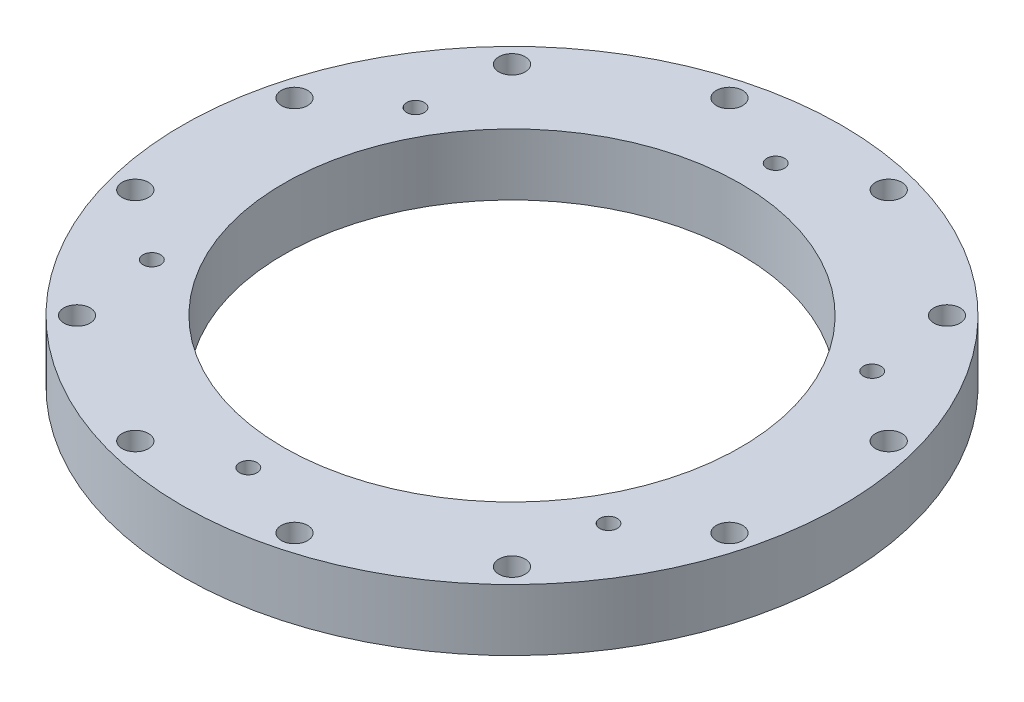
ISO-10303-21;
HEADER;
FILE_DESCRIPTION(('STEP AP214'),'2;1');
FILE_NAME('part.step','',(''),(''),'','','');
FILE_SCHEMA(('AUTOMOTIVE_DESIGN { 1 0 10303 214 1 1 1 1 }'));
ENDSEC;
DATA;
#1=APPLICATION_CONTEXT('core data for automotive mechanical design processes');
#2=APPLICATION_PROTOCOL_DEFINITION('international standard','automotive_design',2000,#1);
#3=PRODUCT_CONTEXT('',#1,'mechanical');
#4=PRODUCT('Part','Part','',(#3));
#5=PRODUCT_RELATED_PRODUCT_CATEGORY('part','',(#4));
#6=PRODUCT_DEFINITION_FORMATION('','',#4);
#7=PRODUCT_DEFINITION_CONTEXT('part definition',#1,'design');
#8=PRODUCT_DEFINITION('design','',#6,#7);
#9=PRODUCT_DEFINITION_SHAPE('','',#8);
#10=(LENGTH_UNIT() NAMED_UNIT(*) SI_UNIT(.MILLI.,.METRE.));
#11=(NAMED_UNIT(*) PLANE_ANGLE_UNIT() SI_UNIT($,.RADIAN.));
#12=(NAMED_UNIT(*) SI_UNIT($,.STERADIAN.) SOLID_ANGLE_UNIT());
#13=UNCERTAINTY_MEASURE_WITH_UNIT(LENGTH_MEASURE(1.E-05),#10,'distance_accuracy_value','');
#14=(GEOMETRIC_REPRESENTATION_CONTEXT(3) GLOBAL_UNCERTAINTY_ASSIGNED_CONTEXT((#13)) GLOBAL_UNIT_ASSIGNED_CONTEXT((#10,
#11,#12)) REPRESENTATION_CONTEXT('',''));
#15=CARTESIAN_POINT('',(0.,0.,0.));
#16=DIRECTION('',(0.,0.,1.));
#17=DIRECTION('',(1.,0.,0.));
#18=AXIS2_PLACEMENT_3D('',#15,#16,#17);
#19=CARTESIAN_POINT('',(0.,7.,0.));
#20=DIRECTION('',(0.,1.,0.));
#21=DIRECTION('',(0.,0.,1.));
#22=AXIS2_PLACEMENT_3D('',#19,#20,#21);
#23=PLANE('',#22);
#24=CARTESIAN_POINT('',(-9.05866657858883,7.,33.8074039201172));
#25=DIRECTION('',(0.,1.,0.));
#26=DIRECTION('',(0.,0.,1.));
#27=AXIS2_PLACEMENT_3D('',#24,#25,#26);
#28=CIRCLE('',#27,1.5);
#29=CARTESIAN_POINT('',(-9.05866657858883,7.,35.3074039201172));
#30=VERTEX_POINT('',#29);
#31=EDGE_CURVE('E143',#30,#30,#28,.T.);
#32=ORIENTED_EDGE('',*,*,#31,.F.);
#33=EDGE_LOOP('',(#32));
#34=FACE_BOUND('',#33,.T.);
#35=CARTESIAN_POINT('',(24.7487373415288,7.,24.7487373415295));
#36=DIRECTION('',(0.,1.,0.));
#37=DIRECTION('',(0.,0.,1.));
#38=AXIS2_PLACEMENT_3D('',#35,#36,#37);
#39=CIRCLE('',#38,1.5);
#40=CARTESIAN_POINT('',(24.7487373415288,7.,26.2487373415295));
#41=VERTEX_POINT('',#40);
#42=EDGE_CURVE('E131',#41,#41,#39,.T.);
#43=ORIENTED_EDGE('',*,*,#42,.F.);
#44=EDGE_LOOP('',(#43));
#45=FACE_BOUND('',#44,.T.);
#46=CARTESIAN_POINT('',(33.8074039201175,7.,-9.05866657858778));
#47=DIRECTION('',(0.,1.,0.));
#48=DIRECTION('',(0.,0.,1.));
#49=AXIS2_PLACEMENT_3D('',#46,#47,#48);
#50=CIRCLE('',#49,1.5);
#51=CARTESIAN_POINT('',(33.8074039201175,7.,-7.55866657858777));
#52=VERTEX_POINT('',#51);
#53=EDGE_CURVE('E119',#52,#52,#50,.T.);
#54=ORIENTED_EDGE('',*,*,#53,.F.);
#55=EDGE_LOOP('',(#54));
#56=FACE_BOUND('',#55,.T.);
#57=CARTESIAN_POINT('',(9.05866657858861,7.,-33.8074039201173));
#58=DIRECTION('',(0.,1.,0.));
#59=DIRECTION('',(0.,0.,1.));
#60=AXIS2_PLACEMENT_3D('',#57,#58,#59);
#61=CIRCLE('',#60,1.5);
#62=CARTESIAN_POINT('',(9.05866657858861,7.,-32.3074039201173));
#63=VERTEX_POINT('',#62);
#64=EDGE_CURVE('E107',#63,#63,#61,.T.);
#65=ORIENTED_EDGE('',*,*,#64,.F.);
#66=EDGE_LOOP('',(#65));
#67=FACE_BOUND('',#66,.T.);
#68=CARTESIAN_POINT('',(-24.7487373415289,7.,-24.7487373415294));
#69=DIRECTION('',(0.,1.,0.));
#70=DIRECTION('',(0.,0.,1.));
#71=AXIS2_PLACEMENT_3D('',#68,#69,#70);
#72=CIRCLE('',#71,1.5);
#73=CARTESIAN_POINT('',(-24.7487373415289,7.,-23.2487373415294));
#74=VERTEX_POINT('',#73);
#75=EDGE_CURVE('E95',#74,#74,#72,.T.);
#76=ORIENTED_EDGE('',*,*,#75,.F.);
#77=EDGE_LOOP('',(#76));
#78=FACE_BOUND('',#77,.T.);
#79=CARTESIAN_POINT('',(-33.8074039201175,7.,9.05866657858801));
#80=DIRECTION('',(0.,1.,0.));
#81=DIRECTION('',(0.,0.,1.));
#82=AXIS2_PLACEMENT_3D('',#79,#80,#81);
#83=CIRCLE('',#82,1.5);
#84=CARTESIAN_POINT('',(-33.8074039201175,7.,10.558666578588));
#85=VERTEX_POINT('',#84);
#86=EDGE_CURVE('E83',#85,#85,#83,.T.);
#87=ORIENTED_EDGE('',*,*,#86,.F.);
#88=EDGE_LOOP('',(#87));
#89=FACE_BOUND('',#88,.T.);
#90=CARTESIAN_POINT('',(-25.9807621135312,7.,15.0000000000011));
#91=DIRECTION('',(0.,1.,0.));
#92=DIRECTION('',(0.,0.,1.));
#93=AXIS2_PLACEMENT_3D('',#90,#91,#92);
#94=CIRCLE('',#93,1.00000000000243);
#95=CARTESIAN_POINT('',(-25.9807621135312,7.,16.0000000000035));
#96=VERTEX_POINT('',#95);
#97=EDGE_CURVE('E71',#96,#96,#94,.T.);
#98=ORIENTED_EDGE('',*,*,#97,.F.);
#99=EDGE_LOOP('',(#98));
#100=FACE_BOUND('',#99,.T.);
#101=CARTESIAN_POINT('',(25.9807621135351,7.,14.9999999999989));
#102=DIRECTION('',(0.,1.,0.));
#103=DIRECTION('',(0.,0.,1.));
#104=AXIS2_PLACEMENT_3D('',#101,#102,#103);
#105=CIRCLE('',#104,1.00000000000165);
#106=CARTESIAN_POINT('',(25.9807621135351,7.,16.0000000000005));
#107=VERTEX_POINT('',#106);
#108=EDGE_CURVE('E59',#107,#107,#105,.T.);
#109=ORIENTED_EDGE('',*,*,#108,.F.);
#110=EDGE_LOOP('',(#109));
#111=FACE_BOUND('',#110,.T.);
#112=CARTESIAN_POINT('',(0.,7.,-30.));
#113=DIRECTION('',(0.,1.,0.));
#114=DIRECTION('',(0.,0.,1.));
#115=AXIS2_PLACEMENT_3D('',#112,#113,#114);
#116=CIRCLE('',#115,1.);
#117=CARTESIAN_POINT('',(0.,7.,-29.));
#118=VERTEX_POINT('',#117);
#119=EDGE_CURVE('E47',#118,#118,#116,.T.);
#120=ORIENTED_EDGE('',*,*,#119,.F.);
#121=EDGE_LOOP('',(#120));
#122=FACE_BOUND('',#121,.T.);
#123=CARTESIAN_POINT('',(0.,7.,0.));
#124=DIRECTION('',(0.,1.,0.));
#125=DIRECTION('',(0.,0.,1.));
#126=AXIS2_PLACEMENT_3D('',#123,#124,#125);
#127=CIRCLE('',#126,37.5);
#128=CARTESIAN_POINT('',(0.,7.,37.5));
#129=VERTEX_POINT('',#128);
#130=EDGE_CURVE('E10',#129,#129,#127,.T.);
#131=ORIENTED_EDGE('',*,*,#130,.T.);
#132=EDGE_LOOP('',(#131));
#133=FACE_BOUND('',#132,.T.);
#134=CARTESIAN_POINT('',(0.,7.,0.));
#135=DIRECTION('',(0.,1.,0.));
#136=DIRECTION('',(0.,0.,1.));
#137=AXIS2_PLACEMENT_3D('',#134,#135,#136);
#138=CIRCLE('',#137,26.);
#139=CARTESIAN_POINT('',(0.,7.,26.));
#140=VERTEX_POINT('',#139);
#141=EDGE_CURVE('E42',#140,#140,#138,.T.);
#142=ORIENTED_EDGE('',*,*,#141,.F.);
#143=EDGE_LOOP('',(#142));
#144=FACE_BOUND('',#143,.T.);
#145=CARTESIAN_POINT('',(25.9807621135338,7.,-15.0000000000011));
#146=DIRECTION('',(0.,1.,0.));
#147=DIRECTION('',(0.,0.,1.));
#148=AXIS2_PLACEMENT_3D('',#145,#146,#147);
#149=CIRCLE('',#148,1.00000000000036);
#150=CARTESIAN_POINT('',(25.9807621135338,7.,-14.0000000000007));
#151=VERTEX_POINT('',#150);
#152=EDGE_CURVE('E53',#151,#151,#149,.T.);
#153=ORIENTED_EDGE('',*,*,#152,.F.);
#154=EDGE_LOOP('',(#153));
#155=FACE_BOUND('',#154,.T.);
#156=CARTESIAN_POINT('',(2.54693202754403E-12,7.,30.));
#157=DIRECTION('',(0.,1.,0.));
#158=DIRECTION('',(0.,0.,1.));
#159=AXIS2_PLACEMENT_3D('',#156,#157,#158);
#160=CIRCLE('',#159,1.00000000000264);
#161=CARTESIAN_POINT('',(2.54693202754403E-12,7.,31.0000000000026));
#162=VERTEX_POINT('',#161);
#163=EDGE_CURVE('E65',#162,#162,#160,.T.);
#164=ORIENTED_EDGE('',*,*,#163,.F.);
#165=EDGE_LOOP('',(#164));
#166=FACE_BOUND('',#165,.T.);
#167=CARTESIAN_POINT('',(-25.9807621135325,7.,-14.9999999999989));
#168=DIRECTION('',(0.,1.,0.));
#169=DIRECTION('',(0.,0.,1.));
#170=AXIS2_PLACEMENT_3D('',#167,#168,#169);
#171=CIRCLE('',#170,1.00000000000129);
#172=CARTESIAN_POINT('',(-25.9807621135325,7.,-13.9999999999976));
#173=VERTEX_POINT('',#172);
#174=EDGE_CURVE('E77',#173,#173,#171,.T.);
#175=ORIENTED_EDGE('',*,*,#174,.F.);
#176=EDGE_LOOP('',(#175));
#177=FACE_BOUND('',#176,.T.);
#178=CARTESIAN_POINT('',(-33.8074039201173,7.,-9.05866657858849));
#179=DIRECTION('',(0.,1.,0.));
#180=DIRECTION('',(0.,0.,1.));
#181=AXIS2_PLACEMENT_3D('',#178,#179,#180);
#182=CIRCLE('',#181,1.50000000000001);
#183=CARTESIAN_POINT('',(-33.8074039201173,7.,-7.55866657858848));
#184=VERTEX_POINT('',#183);
#185=EDGE_CURVE('E89',#184,#184,#182,.T.);
#186=ORIENTED_EDGE('',*,*,#185,.F.);
#187=EDGE_LOOP('',(#186));
#188=FACE_BOUND('',#187,.T.);
#189=CARTESIAN_POINT('',(-9.05866657858789,7.,-33.8074039201175));
#190=DIRECTION('',(0.,1.,0.));
#191=DIRECTION('',(0.,0.,1.));
#192=AXIS2_PLACEMENT_3D('',#189,#190,#191);
#193=CIRCLE('',#192,1.50000000000001);
#194=CARTESIAN_POINT('',(-9.05866657858789,7.,-32.3074039201175));
#195=VERTEX_POINT('',#194);
#196=EDGE_CURVE('E101',#195,#195,#193,.T.);
#197=ORIENTED_EDGE('',*,*,#196,.F.);
#198=EDGE_LOOP('',(#197));
#199=FACE_BOUND('',#198,.T.);
#200=CARTESIAN_POINT('',(24.7487373415295,7.,-24.7487373415289));
#201=DIRECTION('',(0.,1.,0.));
#202=DIRECTION('',(0.,0.,1.));
#203=AXIS2_PLACEMENT_3D('',#200,#201,#202);
#204=CIRCLE('',#203,1.5);
#205=CARTESIAN_POINT('',(24.7487373415295,7.,-23.2487373415289));
#206=VERTEX_POINT('',#205);
#207=EDGE_CURVE('E113',#206,#206,#204,.T.);
#208=ORIENTED_EDGE('',*,*,#207,.F.);
#209=EDGE_LOOP('',(#208));
#210=FACE_BOUND('',#209,.T.);
#211=CARTESIAN_POINT('',(33.8074039201173,7.,9.05866657858872));
#212=DIRECTION('',(0.,1.,0.));
#213=DIRECTION('',(0.,0.,1.));
#214=AXIS2_PLACEMENT_3D('',#211,#212,#213);
#215=CIRCLE('',#214,1.50000000000001);
#216=CARTESIAN_POINT('',(33.8074039201173,7.,10.5586665785887));
#217=VERTEX_POINT('',#216);
#218=EDGE_CURVE('E125',#217,#217,#215,.T.);
#219=ORIENTED_EDGE('',*,*,#218,.F.);
#220=EDGE_LOOP('',(#219));
#221=FACE_BOUND('',#220,.T.);
#222=CARTESIAN_POINT('',(9.05866657858765,7.,33.8074039201176));
#223=DIRECTION('',(0.,1.,0.));
#224=DIRECTION('',(0.,0.,1.));
#225=AXIS2_PLACEMENT_3D('',#222,#223,#224);
#226=CIRCLE('',#225,1.50000000000001);
#227=CARTESIAN_POINT('',(9.05866657858765,7.,35.3074039201176));
#228=VERTEX_POINT('',#227);
#229=EDGE_CURVE('E137',#228,#228,#226,.T.);
#230=ORIENTED_EDGE('',*,*,#229,.F.);
#231=EDGE_LOOP('',(#230));
#232=FACE_BOUND('',#231,.T.);
#233=CARTESIAN_POINT('',(-24.7487373415296,7.,24.7487373415287));
#234=DIRECTION('',(0.,1.,0.));
#235=DIRECTION('',(0.,0.,1.));
#236=AXIS2_PLACEMENT_3D('',#233,#234,#235);
#237=CIRCLE('',#236,1.50000000000001);
#238=CARTESIAN_POINT('',(-24.7487373415296,7.,26.2487373415287));
#239=VERTEX_POINT('',#238);
#240=EDGE_CURVE('E149',#239,#239,#237,.T.);
#241=ORIENTED_EDGE('',*,*,#240,.F.);
#242=EDGE_LOOP('',(#241));
#243=FACE_BOUND('',#242,.T.);
#244=ADVANCED_FACE('F31',(#34,#45,#56,#67,#78,#89,#100,#111,#122,#133,#144,#155,#166,#177,#188,
#199,#210,#221,#232,#243),#23,.T.);
#245=CARTESIAN_POINT('',(0.,0.,0.));
#246=DIRECTION('',(0.,1.,0.));
#247=DIRECTION('',(0.,0.,1.));
#248=AXIS2_PLACEMENT_3D('',#245,#246,#247);
#249=PLANE('',#248);
#250=CARTESIAN_POINT('',(0.,0.,0.));
#251=DIRECTION('',(0.,1.,0.));
#252=DIRECTION('',(0.,0.,1.));
#253=AXIS2_PLACEMENT_3D('',#250,#251,#252);
#254=CIRCLE('',#253,37.5);
#255=CARTESIAN_POINT('',(0.,0.,37.5));
#256=VERTEX_POINT('',#255);
#257=EDGE_CURVE('E35',#256,#256,#254,.T.);
#258=ORIENTED_EDGE('',*,*,#257,.F.);
#259=EDGE_LOOP('',(#258));
#260=FACE_BOUND('',#259,.T.);
#261=CARTESIAN_POINT('',(0.,0.,0.));
#262=DIRECTION('',(0.,1.,0.));
#263=DIRECTION('',(0.,0.,1.));
#264=AXIS2_PLACEMENT_3D('',#261,#262,#263);
#265=CIRCLE('',#264,26.);
#266=CARTESIAN_POINT('',(0.,0.,26.));
#267=VERTEX_POINT('',#266);
#268=EDGE_CURVE('E44',#267,#267,#265,.T.);
#269=ORIENTED_EDGE('',*,*,#268,.T.);
#270=EDGE_LOOP('',(#269));
#271=FACE_BOUND('',#270,.T.);
#272=CARTESIAN_POINT('',(0.,0.,-30.));
#273=DIRECTION('',(0.,1.,0.));
#274=DIRECTION('',(0.,0.,1.));
#275=AXIS2_PLACEMENT_3D('',#272,#273,#274);
#276=CIRCLE('',#275,1.);
#277=CARTESIAN_POINT('',(0.,0.,-29.));
#278=VERTEX_POINT('',#277);
#279=EDGE_CURVE('E50',#278,#278,#276,.T.);
#280=ORIENTED_EDGE('',*,*,#279,.T.);
#281=EDGE_LOOP('',(#280));
#282=FACE_BOUND('',#281,.T.);
#283=CARTESIAN_POINT('',(25.9807621135338,0.,-15.0000000000011));
#284=DIRECTION('',(0.,1.,0.));
#285=DIRECTION('',(0.,0.,1.));
#286=AXIS2_PLACEMENT_3D('',#283,#284,#285);
#287=CIRCLE('',#286,1.00000000000036);
#288=CARTESIAN_POINT('',(25.9807621135338,0.,-14.0000000000007));
#289=VERTEX_POINT('',#288);
#290=EDGE_CURVE('E56',#289,#289,#287,.T.);
#291=ORIENTED_EDGE('',*,*,#290,.T.);
#292=EDGE_LOOP('',(#291));
#293=FACE_BOUND('',#292,.T.);
#294=CARTESIAN_POINT('',(25.9807621135351,0.,14.9999999999989));
#295=DIRECTION('',(0.,1.,0.));
#296=DIRECTION('',(0.,0.,1.));
#297=AXIS2_PLACEMENT_3D('',#294,#295,#296);
#298=CIRCLE('',#297,1.00000000000165);
#299=CARTESIAN_POINT('',(25.9807621135351,0.,16.0000000000005));
#300=VERTEX_POINT('',#299);
#301=EDGE_CURVE('E62',#300,#300,#298,.T.);
#302=ORIENTED_EDGE('',*,*,#301,.T.);
#303=EDGE_LOOP('',(#302));
#304=FACE_BOUND('',#303,.T.);
#305=CARTESIAN_POINT('',(2.54693202754403E-12,0.,30.));
#306=DIRECTION('',(0.,1.,0.));
#307=DIRECTION('',(0.,0.,1.));
#308=AXIS2_PLACEMENT_3D('',#305,#306,#307);
#309=CIRCLE('',#308,1.00000000000264);
#310=CARTESIAN_POINT('',(2.54693202754403E-12,0.,31.0000000000026));
#311=VERTEX_POINT('',#310);
#312=EDGE_CURVE('E68',#311,#311,#309,.T.);
#313=ORIENTED_EDGE('',*,*,#312,.T.);
#314=EDGE_LOOP('',(#313));
#315=FACE_BOUND('',#314,.T.);
#316=CARTESIAN_POINT('',(-25.9807621135312,0.,15.0000000000011));
#317=DIRECTION('',(0.,1.,0.));
#318=DIRECTION('',(0.,0.,1.));
#319=AXIS2_PLACEMENT_3D('',#316,#317,#318);
#320=CIRCLE('',#319,1.00000000000243);
#321=CARTESIAN_POINT('',(-25.9807621135312,0.,16.0000000000035));
#322=VERTEX_POINT('',#321);
#323=EDGE_CURVE('E74',#322,#322,#320,.T.);
#324=ORIENTED_EDGE('',*,*,#323,.T.);
#325=EDGE_LOOP('',(#324));
#326=FACE_BOUND('',#325,.T.);
#327=CARTESIAN_POINT('',(-25.9807621135325,0.,-14.9999999999989));
#328=DIRECTION('',(0.,1.,0.));
#329=DIRECTION('',(0.,0.,1.));
#330=AXIS2_PLACEMENT_3D('',#327,#328,#329);
#331=CIRCLE('',#330,1.00000000000129);
#332=CARTESIAN_POINT('',(-25.9807621135325,0.,-13.9999999999976));
#333=VERTEX_POINT('',#332);
#334=EDGE_CURVE('E80',#333,#333,#331,.T.);
#335=ORIENTED_EDGE('',*,*,#334,.T.);
#336=EDGE_LOOP('',(#335));
#337=FACE_BOUND('',#336,.T.);
#338=CARTESIAN_POINT('',(-33.8074039201175,0.,9.05866657858801));
#339=DIRECTION('',(0.,1.,0.));
#340=DIRECTION('',(0.,0.,1.));
#341=AXIS2_PLACEMENT_3D('',#338,#339,#340);
#342=CIRCLE('',#341,1.5);
#343=CARTESIAN_POINT('',(-33.8074039201175,0.,10.558666578588));
#344=VERTEX_POINT('',#343);
#345=EDGE_CURVE('E86',#344,#344,#342,.T.);
#346=ORIENTED_EDGE('',*,*,#345,.T.);
#347=EDGE_LOOP('',(#346));
#348=FACE_BOUND('',#347,.T.);
#349=CARTESIAN_POINT('',(-33.8074039201173,0.,-9.05866657858849));
#350=DIRECTION('',(0.,1.,0.));
#351=DIRECTION('',(0.,0.,1.));
#352=AXIS2_PLACEMENT_3D('',#349,#350,#351);
#353=CIRCLE('',#352,1.50000000000001);
#354=CARTESIAN_POINT('',(-33.8074039201173,0.,-7.55866657858848));
#355=VERTEX_POINT('',#354);
#356=EDGE_CURVE('E92',#355,#355,#353,.T.);
#357=ORIENTED_EDGE('',*,*,#356,.T.);
#358=EDGE_LOOP('',(#357));
#359=FACE_BOUND('',#358,.T.);
#360=CARTESIAN_POINT('',(-24.7487373415289,0.,-24.7487373415294));
#361=DIRECTION('',(0.,1.,0.));
#362=DIRECTION('',(0.,0.,1.));
#363=AXIS2_PLACEMENT_3D('',#360,#361,#362);
#364=CIRCLE('',#363,1.5);
#365=CARTESIAN_POINT('',(-24.7487373415289,0.,-23.2487373415294));
#366=VERTEX_POINT('',#365);
#367=EDGE_CURVE('E98',#366,#366,#364,.T.);
#368=ORIENTED_EDGE('',*,*,#367,.T.);
#369=EDGE_LOOP('',(#368));
#370=FACE_BOUND('',#369,.T.);
#371=CARTESIAN_POINT('',(-9.05866657858789,0.,-33.8074039201175));
#372=DIRECTION('',(0.,1.,0.));
#373=DIRECTION('',(0.,0.,1.));
#374=AXIS2_PLACEMENT_3D('',#371,#372,#373);
#375=CIRCLE('',#374,1.50000000000001);
#376=CARTESIAN_POINT('',(-9.05866657858789,0.,-32.3074039201175));
#377=VERTEX_POINT('',#376);
#378=EDGE_CURVE('E104',#377,#377,#375,.T.);
#379=ORIENTED_EDGE('',*,*,#378,.T.);
#380=EDGE_LOOP('',(#379));
#381=FACE_BOUND('',#380,.T.);
#382=CARTESIAN_POINT('',(9.05866657858861,0.,-33.8074039201173));
#383=DIRECTION('',(0.,1.,0.));
#384=DIRECTION('',(0.,0.,1.));
#385=AXIS2_PLACEMENT_3D('',#382,#383,#384);
#386=CIRCLE('',#385,1.5);
#387=CARTESIAN_POINT('',(9.05866657858861,0.,-32.3074039201173));
#388=VERTEX_POINT('',#387);
#389=EDGE_CURVE('E110',#388,#388,#386,.T.);
#390=ORIENTED_EDGE('',*,*,#389,.T.);
#391=EDGE_LOOP('',(#390));
#392=FACE_BOUND('',#391,.T.);
#393=CARTESIAN_POINT('',(24.7487373415295,0.,-24.7487373415289));
#394=DIRECTION('',(0.,1.,0.));
#395=DIRECTION('',(0.,0.,1.));
#396=AXIS2_PLACEMENT_3D('',#393,#394,#395);
#397=CIRCLE('',#396,1.5);
#398=CARTESIAN_POINT('',(24.7487373415295,0.,-23.2487373415289));
#399=VERTEX_POINT('',#398);
#400=EDGE_CURVE('E116',#399,#399,#397,.T.);
#401=ORIENTED_EDGE('',*,*,#400,.T.);
#402=EDGE_LOOP('',(#401));
#403=FACE_BOUND('',#402,.T.);
#404=CARTESIAN_POINT('',(33.8074039201175,0.,-9.05866657858778));
#405=DIRECTION('',(0.,1.,0.));
#406=DIRECTION('',(0.,0.,1.));
#407=AXIS2_PLACEMENT_3D('',#404,#405,#406);
#408=CIRCLE('',#407,1.5);
#409=CARTESIAN_POINT('',(33.8074039201175,0.,-7.55866657858777));
#410=VERTEX_POINT('',#409);
#411=EDGE_CURVE('E122',#410,#410,#408,.T.);
#412=ORIENTED_EDGE('',*,*,#411,.T.);
#413=EDGE_LOOP('',(#412));
#414=FACE_BOUND('',#413,.T.);
#415=CARTESIAN_POINT('',(33.8074039201173,0.,9.05866657858872));
#416=DIRECTION('',(0.,1.,0.));
#417=DIRECTION('',(0.,0.,1.));
#418=AXIS2_PLACEMENT_3D('',#415,#416,#417);
#419=CIRCLE('',#418,1.50000000000001);
#420=CARTESIAN_POINT('',(33.8074039201173,0.,10.5586665785887));
#421=VERTEX_POINT('',#420);
#422=EDGE_CURVE('E128',#421,#421,#419,.T.);
#423=ORIENTED_EDGE('',*,*,#422,.T.);
#424=EDGE_LOOP('',(#423));
#425=FACE_BOUND('',#424,.T.);
#426=CARTESIAN_POINT('',(24.7487373415288,0.,24.7487373415295));
#427=DIRECTION('',(0.,1.,0.));
#428=DIRECTION('',(0.,0.,1.));
#429=AXIS2_PLACEMENT_3D('',#426,#427,#428);
#430=CIRCLE('',#429,1.5);
#431=CARTESIAN_POINT('',(24.7487373415288,0.,26.2487373415295));
#432=VERTEX_POINT('',#431);
#433=EDGE_CURVE('E134',#432,#432,#430,.T.);
#434=ORIENTED_EDGE('',*,*,#433,.T.);
#435=EDGE_LOOP('',(#434));
#436=FACE_BOUND('',#435,.T.);
#437=CARTESIAN_POINT('',(9.05866657858765,0.,33.8074039201176));
#438=DIRECTION('',(0.,1.,0.));
#439=DIRECTION('',(0.,0.,1.));
#440=AXIS2_PLACEMENT_3D('',#437,#438,#439);
#441=CIRCLE('',#440,1.50000000000001);
#442=CARTESIAN_POINT('',(9.05866657858765,0.,35.3074039201176));
#443=VERTEX_POINT('',#442);
#444=EDGE_CURVE('E140',#443,#443,#441,.T.);
#445=ORIENTED_EDGE('',*,*,#444,.T.);
#446=EDGE_LOOP('',(#445));
#447=FACE_BOUND('',#446,.T.);
#448=CARTESIAN_POINT('',(-9.05866657858883,0.,33.8074039201172));
#449=DIRECTION('',(0.,1.,0.));
#450=DIRECTION('',(0.,0.,1.));
#451=AXIS2_PLACEMENT_3D('',#448,#449,#450);
#452=CIRCLE('',#451,1.5);
#453=CARTESIAN_POINT('',(-9.05866657858883,0.,35.3074039201172));
#454=VERTEX_POINT('',#453);
#455=EDGE_CURVE('E146',#454,#454,#452,.T.);
#456=ORIENTED_EDGE('',*,*,#455,.T.);
#457=EDGE_LOOP('',(#456));
#458=FACE_BOUND('',#457,.T.);
#459=CARTESIAN_POINT('',(-24.7487373415296,0.,24.7487373415287));
#460=DIRECTION('',(0.,1.,0.));
#461=DIRECTION('',(0.,0.,1.));
#462=AXIS2_PLACEMENT_3D('',#459,#460,#461);
#463=CIRCLE('',#462,1.50000000000001);
#464=CARTESIAN_POINT('',(-24.7487373415296,0.,26.2487373415287));
#465=VERTEX_POINT('',#464);
#466=EDGE_CURVE('E152',#465,#465,#463,.T.);
#467=ORIENTED_EDGE('',*,*,#466,.T.);
#468=EDGE_LOOP('',(#467));
#469=FACE_BOUND('',#468,.T.);
#470=ADVANCED_FACE('F162',(#260,#271,#282,#293,#304,#315,#326,#337,#348,#359,#370,#381,#392,
#403,#414,#425,#436,#447,#458,#469),#249,.F.);
#471=CARTESIAN_POINT('',(0.,7.,0.));
#472=DIRECTION('',(0.,-1.,0.));
#473=DIRECTION('',(0.,0.,-1.));
#474=AXIS2_PLACEMENT_3D('',#471,#472,#473);
#475=CYLINDRICAL_SURFACE('',#474,37.5);
#476=ORIENTED_EDGE('',*,*,#130,.F.);
#477=EDGE_LOOP('',(#476));
#478=FACE_BOUND('',#477,.T.);
#479=ORIENTED_EDGE('',*,*,#257,.T.);
#480=EDGE_LOOP('',(#479));
#481=FACE_BOUND('',#480,.T.);
#482=ADVANCED_FACE('F33',(#478,#481),#475,.T.);
#483=CARTESIAN_POINT('',(0.,7.,0.));
#484=DIRECTION('',(0.,-1.,0.));
#485=DIRECTION('',(0.,0.,-1.));
#486=AXIS2_PLACEMENT_3D('',#483,#484,#485);
#487=CYLINDRICAL_SURFACE('',#486,26.);
#488=ORIENTED_EDGE('',*,*,#141,.T.);
#489=EDGE_LOOP('',(#488));
#490=FACE_BOUND('',#489,.T.);
#491=ORIENTED_EDGE('',*,*,#268,.F.);
#492=EDGE_LOOP('',(#491));
#493=FACE_BOUND('',#492,.T.);
#494=ADVANCED_FACE('F172',(#490,#493),#487,.F.);
#495=CARTESIAN_POINT('',(0.,7.,-30.));
#496=DIRECTION('',(0.,-1.,0.));
#497=DIRECTION('',(0.,0.,-1.));
#498=AXIS2_PLACEMENT_3D('',#495,#496,#497);
#499=CYLINDRICAL_SURFACE('',#498,1.);
#500=ORIENTED_EDGE('',*,*,#119,.T.);
#501=EDGE_LOOP('',(#500));
#502=FACE_BOUND('',#501,.T.);
#503=ORIENTED_EDGE('',*,*,#279,.F.);
#504=EDGE_LOOP('',(#503));
#505=FACE_BOUND('',#504,.T.);
#506=ADVANCED_FACE('F175',(#502,#505),#499,.F.);
#507=CARTESIAN_POINT('',(25.9807621135338,7.,-15.0000000000011));
#508=DIRECTION('',(0.,-1.,0.));
#509=DIRECTION('',(0.,0.,-1.));
#510=AXIS2_PLACEMENT_3D('',#507,#508,#509);
#511=CYLINDRICAL_SURFACE('',#510,1.00000000000036);
#512=ORIENTED_EDGE('',*,*,#152,.T.);
#513=EDGE_LOOP('',(#512));
#514=FACE_BOUND('',#513,.T.);
#515=ORIENTED_EDGE('',*,*,#290,.F.);
#516=EDGE_LOOP('',(#515));
#517=FACE_BOUND('',#516,.T.);
#518=ADVANCED_FACE('F179',(#514,#517),#511,.F.);
#519=CARTESIAN_POINT('',(25.9807621135351,7.,14.9999999999989));
#520=DIRECTION('',(0.,-1.,0.));
#521=DIRECTION('',(0.,0.,-1.));
#522=AXIS2_PLACEMENT_3D('',#519,#520,#521);
#523=CYLINDRICAL_SURFACE('',#522,1.00000000000165);
#524=ORIENTED_EDGE('',*,*,#108,.T.);
#525=EDGE_LOOP('',(#524));
#526=FACE_BOUND('',#525,.T.);
#527=ORIENTED_EDGE('',*,*,#301,.F.);
#528=EDGE_LOOP('',(#527));
#529=FACE_BOUND('',#528,.T.);
#530=ADVANCED_FACE('F183',(#526,#529),#523,.F.);
#531=CARTESIAN_POINT('',(2.54693202754403E-12,7.,30.));
#532=DIRECTION('',(0.,-1.,0.));
#533=DIRECTION('',(0.,0.,-1.));
#534=AXIS2_PLACEMENT_3D('',#531,#532,#533);
#535=CYLINDRICAL_SURFACE('',#534,1.00000000000264);
#536=ORIENTED_EDGE('',*,*,#163,.T.);
#537=EDGE_LOOP('',(#536));
#538=FACE_BOUND('',#537,.T.);
#539=ORIENTED_EDGE('',*,*,#312,.F.);
#540=EDGE_LOOP('',(#539));
#541=FACE_BOUND('',#540,.T.);
#542=ADVANCED_FACE('F187',(#538,#541),#535,.F.);
#543=CARTESIAN_POINT('',(-25.9807621135312,7.,15.0000000000011));
#544=DIRECTION('',(0.,-1.,0.));
#545=DIRECTION('',(0.,0.,-1.));
#546=AXIS2_PLACEMENT_3D('',#543,#544,#545);
#547=CYLINDRICAL_SURFACE('',#546,1.00000000000243);
#548=ORIENTED_EDGE('',*,*,#97,.T.);
#549=EDGE_LOOP('',(#548));
#550=FACE_BOUND('',#549,.T.);
#551=ORIENTED_EDGE('',*,*,#323,.F.);
#552=EDGE_LOOP('',(#551));
#553=FACE_BOUND('',#552,.T.);
#554=ADVANCED_FACE('F191',(#550,#553),#547,.F.);
#555=CARTESIAN_POINT('',(-25.9807621135325,7.,-14.9999999999989));
#556=DIRECTION('',(0.,-1.,0.));
#557=DIRECTION('',(0.,0.,-1.));
#558=AXIS2_PLACEMENT_3D('',#555,#556,#557);
#559=CYLINDRICAL_SURFACE('',#558,1.00000000000129);
#560=ORIENTED_EDGE('',*,*,#174,.T.);
#561=EDGE_LOOP('',(#560));
#562=FACE_BOUND('',#561,.T.);
#563=ORIENTED_EDGE('',*,*,#334,.F.);
#564=EDGE_LOOP('',(#563));
#565=FACE_BOUND('',#564,.T.);
#566=ADVANCED_FACE('F195',(#562,#565),#559,.F.);
#567=CARTESIAN_POINT('',(-33.8074039201175,7.,9.05866657858801));
#568=DIRECTION('',(0.,-1.,0.));
#569=DIRECTION('',(0.,0.,-1.));
#570=AXIS2_PLACEMENT_3D('',#567,#568,#569);
#571=CYLINDRICAL_SURFACE('',#570,1.5);
#572=ORIENTED_EDGE('',*,*,#86,.T.);
#573=EDGE_LOOP('',(#572));
#574=FACE_BOUND('',#573,.T.);
#575=ORIENTED_EDGE('',*,*,#345,.F.);
#576=EDGE_LOOP('',(#575));
#577=FACE_BOUND('',#576,.T.);
#578=ADVANCED_FACE('F199',(#574,#577),#571,.F.);
#579=CARTESIAN_POINT('',(-33.8074039201173,7.,-9.05866657858849));
#580=DIRECTION('',(0.,-1.,0.));
#581=DIRECTION('',(0.,0.,-1.));
#582=AXIS2_PLACEMENT_3D('',#579,#580,#581);
#583=CYLINDRICAL_SURFACE('',#582,1.50000000000001);
#584=ORIENTED_EDGE('',*,*,#185,.T.);
#585=EDGE_LOOP('',(#584));
#586=FACE_BOUND('',#585,.T.);
#587=ORIENTED_EDGE('',*,*,#356,.F.);
#588=EDGE_LOOP('',(#587));
#589=FACE_BOUND('',#588,.T.);
#590=ADVANCED_FACE('F203',(#586,#589),#583,.F.);
#591=CARTESIAN_POINT('',(-24.7487373415289,7.,-24.7487373415294));
#592=DIRECTION('',(0.,-1.,0.));
#593=DIRECTION('',(0.,0.,-1.));
#594=AXIS2_PLACEMENT_3D('',#591,#592,#593);
#595=CYLINDRICAL_SURFACE('',#594,1.5);
#596=ORIENTED_EDGE('',*,*,#75,.T.);
#597=EDGE_LOOP('',(#596));
#598=FACE_BOUND('',#597,.T.);
#599=ORIENTED_EDGE('',*,*,#367,.F.);
#600=EDGE_LOOP('',(#599));
#601=FACE_BOUND('',#600,.T.);
#602=ADVANCED_FACE('F207',(#598,#601),#595,.F.);
#603=CARTESIAN_POINT('',(-9.05866657858789,7.,-33.8074039201175));
#604=DIRECTION('',(0.,-1.,0.));
#605=DIRECTION('',(0.,0.,-1.));
#606=AXIS2_PLACEMENT_3D('',#603,#604,#605);
#607=CYLINDRICAL_SURFACE('',#606,1.50000000000001);
#608=ORIENTED_EDGE('',*,*,#196,.T.);
#609=EDGE_LOOP('',(#608));
#610=FACE_BOUND('',#609,.T.);
#611=ORIENTED_EDGE('',*,*,#378,.F.);
#612=EDGE_LOOP('',(#611));
#613=FACE_BOUND('',#612,.T.);
#614=ADVANCED_FACE('F211',(#610,#613),#607,.F.);
#615=CARTESIAN_POINT('',(9.05866657858861,7.,-33.8074039201173));
#616=DIRECTION('',(0.,-1.,0.));
#617=DIRECTION('',(0.,0.,-1.));
#618=AXIS2_PLACEMENT_3D('',#615,#616,#617);
#619=CYLINDRICAL_SURFACE('',#618,1.5);
#620=ORIENTED_EDGE('',*,*,#64,.T.);
#621=EDGE_LOOP('',(#620));
#622=FACE_BOUND('',#621,.T.);
#623=ORIENTED_EDGE('',*,*,#389,.F.);
#624=EDGE_LOOP('',(#623));
#625=FACE_BOUND('',#624,.T.);
#626=ADVANCED_FACE('F215',(#622,#625),#619,.F.);
#627=CARTESIAN_POINT('',(24.7487373415295,7.,-24.7487373415289));
#628=DIRECTION('',(0.,-1.,0.));
#629=DIRECTION('',(0.,0.,-1.));
#630=AXIS2_PLACEMENT_3D('',#627,#628,#629);
#631=CYLINDRICAL_SURFACE('',#630,1.5);
#632=ORIENTED_EDGE('',*,*,#207,.T.);
#633=EDGE_LOOP('',(#632));
#634=FACE_BOUND('',#633,.T.);
#635=ORIENTED_EDGE('',*,*,#400,.F.);
#636=EDGE_LOOP('',(#635));
#637=FACE_BOUND('',#636,.T.);
#638=ADVANCED_FACE('F219',(#634,#637),#631,.F.);
#639=CARTESIAN_POINT('',(33.8074039201175,7.,-9.05866657858778));
#640=DIRECTION('',(0.,-1.,0.));
#641=DIRECTION('',(0.,0.,-1.));
#642=AXIS2_PLACEMENT_3D('',#639,#640,#641);
#643=CYLINDRICAL_SURFACE('',#642,1.5);
#644=ORIENTED_EDGE('',*,*,#53,.T.);
#645=EDGE_LOOP('',(#644));
#646=FACE_BOUND('',#645,.T.);
#647=ORIENTED_EDGE('',*,*,#411,.F.);
#648=EDGE_LOOP('',(#647));
#649=FACE_BOUND('',#648,.T.);
#650=ADVANCED_FACE('F223',(#646,#649),#643,.F.);
#651=CARTESIAN_POINT('',(33.8074039201173,7.,9.05866657858872));
#652=DIRECTION('',(0.,-1.,0.));
#653=DIRECTION('',(0.,0.,-1.));
#654=AXIS2_PLACEMENT_3D('',#651,#652,#653);
#655=CYLINDRICAL_SURFACE('',#654,1.50000000000001);
#656=ORIENTED_EDGE('',*,*,#218,.T.);
#657=EDGE_LOOP('',(#656));
#658=FACE_BOUND('',#657,.T.);
#659=ORIENTED_EDGE('',*,*,#422,.F.);
#660=EDGE_LOOP('',(#659));
#661=FACE_BOUND('',#660,.T.);
#662=ADVANCED_FACE('F227',(#658,#661),#655,.F.);
#663=CARTESIAN_POINT('',(24.7487373415288,7.,24.7487373415295));
#664=DIRECTION('',(0.,-1.,0.));
#665=DIRECTION('',(0.,0.,-1.));
#666=AXIS2_PLACEMENT_3D('',#663,#664,#665);
#667=CYLINDRICAL_SURFACE('',#666,1.5);
#668=ORIENTED_EDGE('',*,*,#42,.T.);
#669=EDGE_LOOP('',(#668));
#670=FACE_BOUND('',#669,.T.);
#671=ORIENTED_EDGE('',*,*,#433,.F.);
#672=EDGE_LOOP('',(#671));
#673=FACE_BOUND('',#672,.T.);
#674=ADVANCED_FACE('F231',(#670,#673),#667,.F.);
#675=CARTESIAN_POINT('',(9.05866657858765,7.,33.8074039201176));
#676=DIRECTION('',(0.,-1.,0.));
#677=DIRECTION('',(0.,0.,-1.));
#678=AXIS2_PLACEMENT_3D('',#675,#676,#677);
#679=CYLINDRICAL_SURFACE('',#678,1.50000000000001);
#680=ORIENTED_EDGE('',*,*,#229,.T.);
#681=EDGE_LOOP('',(#680));
#682=FACE_BOUND('',#681,.T.);
#683=ORIENTED_EDGE('',*,*,#444,.F.);
#684=EDGE_LOOP('',(#683));
#685=FACE_BOUND('',#684,.T.);
#686=ADVANCED_FACE('F235',(#682,#685),#679,.F.);
#687=CARTESIAN_POINT('',(-9.05866657858883,7.,33.8074039201172));
#688=DIRECTION('',(0.,-1.,0.));
#689=DIRECTION('',(0.,0.,-1.));
#690=AXIS2_PLACEMENT_3D('',#687,#688,#689);
#691=CYLINDRICAL_SURFACE('',#690,1.5);
#692=ORIENTED_EDGE('',*,*,#31,.T.);
#693=EDGE_LOOP('',(#692));
#694=FACE_BOUND('',#693,.T.);
#695=ORIENTED_EDGE('',*,*,#455,.F.);
#696=EDGE_LOOP('',(#695));
#697=FACE_BOUND('',#696,.T.);
#698=ADVANCED_FACE('F239',(#694,#697),#691,.F.);
#699=CARTESIAN_POINT('',(-24.7487373415296,7.,24.7487373415287));
#700=DIRECTION('',(0.,-1.,0.));
#701=DIRECTION('',(0.,0.,-1.));
#702=AXIS2_PLACEMENT_3D('',#699,#700,#701);
#703=CYLINDRICAL_SURFACE('',#702,1.50000000000001);
#704=ORIENTED_EDGE('',*,*,#240,.T.);
#705=EDGE_LOOP('',(#704));
#706=FACE_BOUND('',#705,.T.);
#707=ORIENTED_EDGE('',*,*,#466,.F.);
#708=EDGE_LOOP('',(#707));
#709=FACE_BOUND('',#708,.T.);
#710=ADVANCED_FACE('F158',(#706,#709),#703,.F.);
#711=CLOSED_SHELL('',(#244,#470,#482,#494,#506,#518,#530,#542,#554,#566,#578,#590,#602,#614,
#626,#638,#650,#662,#674,#686,#698,#710));
#712=MANIFOLD_SOLID_BREP('B2',#711);
#713=ADVANCED_BREP_SHAPE_REPRESENTATION('',(#18,#712),#14);
#714=SHAPE_DEFINITION_REPRESENTATION(#9,#713);
ENDSEC;
END-ISO-10303-21;
